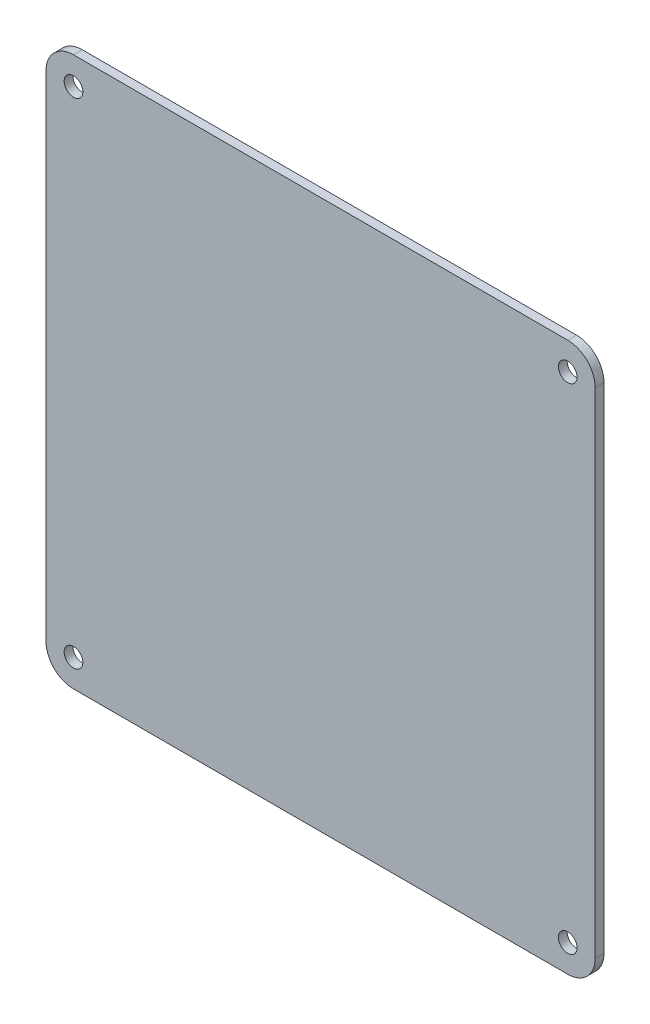
ISO-10303-21;
HEADER;
FILE_DESCRIPTION(('STEP AP214'),'2;1');
FILE_NAME('part.step','',(''),(''),'','','');
FILE_SCHEMA(('AUTOMOTIVE_DESIGN { 1 0 10303 214 1 1 1 1 }'));
ENDSEC;
DATA;
#1=APPLICATION_CONTEXT('core data for automotive mechanical design processes');
#2=APPLICATION_PROTOCOL_DEFINITION('international standard','automotive_design',2000,#1);
#3=PRODUCT_CONTEXT('',#1,'mechanical');
#4=PRODUCT('Part','Part','',(#3));
#5=PRODUCT_RELATED_PRODUCT_CATEGORY('part','',(#4));
#6=PRODUCT_DEFINITION_FORMATION('','',#4);
#7=PRODUCT_DEFINITION_CONTEXT('part definition',#1,'design');
#8=PRODUCT_DEFINITION('design','',#6,#7);
#9=PRODUCT_DEFINITION_SHAPE('','',#8);
#10=(LENGTH_UNIT() NAMED_UNIT(*) SI_UNIT(.MILLI.,.METRE.));
#11=(NAMED_UNIT(*) PLANE_ANGLE_UNIT() SI_UNIT($,.RADIAN.));
#12=(NAMED_UNIT(*) SI_UNIT($,.STERADIAN.) SOLID_ANGLE_UNIT());
#13=UNCERTAINTY_MEASURE_WITH_UNIT(LENGTH_MEASURE(1.E-05),#10,'distance_accuracy_value','');
#14=(GEOMETRIC_REPRESENTATION_CONTEXT(3) GLOBAL_UNCERTAINTY_ASSIGNED_CONTEXT((#13)) GLOBAL_UNIT_ASSIGNED_CONTEXT((#10,
#11,#12)) REPRESENTATION_CONTEXT('',''));
#15=CARTESIAN_POINT('',(0.,0.,0.));
#16=DIRECTION('',(0.,0.,1.));
#17=DIRECTION('',(1.,0.,0.));
#18=AXIS2_PLACEMENT_3D('',#15,#16,#17);
#19=CARTESIAN_POINT('',(45.,-45.,1.6));
#20=DIRECTION('',(0.,0.,-1.));
#21=DIRECTION('',(-1.,0.,0.));
#22=AXIS2_PLACEMENT_3D('',#19,#20,#21);
#23=CYLINDRICAL_SURFACE('',#22,5.);
#24=CARTESIAN_POINT('',(45.,-45.,0.));
#25=DIRECTION('',(0.,0.,1.));
#26=DIRECTION('',(-1.,0.,0.));
#27=AXIS2_PLACEMENT_3D('',#24,#25,#26);
#28=CIRCLE('',#27,5.);
#29=CARTESIAN_POINT('',(45.,-50.,0.));
#30=VERTEX_POINT('',#29);
#31=CARTESIAN_POINT('',(50.,-45.,0.));
#32=VERTEX_POINT('',#31);
#33=EDGE_CURVE('E134',#30,#32,#28,.T.);
#34=ORIENTED_EDGE('',*,*,#33,.T.);
#35=DIRECTION('',(0.,0.,-1.));
#36=VECTOR('',#35,1.);
#37=CARTESIAN_POINT('',(50.,-45.,1.6));
#38=LINE('',#37,#36);
#39=CARTESIAN_POINT('',(50.,-45.,1.6));
#40=VERTEX_POINT('',#39);
#41=EDGE_CURVE('E11',#40,#32,#38,.T.);
#42=ORIENTED_EDGE('',*,*,#41,.F.);
#43=CARTESIAN_POINT('',(45.,-45.,1.6));
#44=DIRECTION('',(0.,0.,1.));
#45=DIRECTION('',(-1.,0.,0.));
#46=AXIS2_PLACEMENT_3D('',#43,#44,#45);
#47=CIRCLE('',#46,5.);
#48=CARTESIAN_POINT('',(45.,-50.,1.6));
#49=VERTEX_POINT('',#48);
#50=EDGE_CURVE('E149',#49,#40,#47,.T.);
#51=ORIENTED_EDGE('',*,*,#50,.F.);
#52=DIRECTION('',(0.,0.,-1.));
#53=VECTOR('',#52,1.);
#54=CARTESIAN_POINT('',(45.,-50.,1.6));
#55=LINE('',#54,#53);
#56=EDGE_CURVE('E130',#49,#30,#55,.T.);
#57=ORIENTED_EDGE('',*,*,#56,.T.);
#58=EDGE_LOOP('',(#34,#42,#51,#57));
#59=FACE_BOUND('',#58,.T.);
#60=ADVANCED_FACE('F38',(#59),#23,.T.);
#61=CARTESIAN_POINT('',(50.,45.,1.6));
#62=DIRECTION('',(-1.,0.,0.));
#63=DIRECTION('',(0.,0.,1.));
#64=AXIS2_PLACEMENT_3D('',#61,#62,#63);
#65=PLANE('',#64);
#66=DIRECTION('',(0.,1.,0.));
#67=VECTOR('',#66,1.);
#68=CARTESIAN_POINT('',(50.,45.,0.));
#69=LINE('',#68,#67);
#70=CARTESIAN_POINT('',(50.,45.,0.));
#71=VERTEX_POINT('',#70);
#72=EDGE_CURVE('E137',#32,#71,#69,.T.);
#73=ORIENTED_EDGE('',*,*,#72,.T.);
#74=DIRECTION('',(0.,0.,-1.));
#75=VECTOR('',#74,1.);
#76=CARTESIAN_POINT('',(50.,45.,1.6));
#77=LINE('',#76,#75);
#78=CARTESIAN_POINT('',(50.,45.,1.6));
#79=VERTEX_POINT('',#78);
#80=EDGE_CURVE('E46',#79,#71,#77,.T.);
#81=ORIENTED_EDGE('',*,*,#80,.F.);
#82=DIRECTION('',(0.,1.,0.));
#83=VECTOR('',#82,1.);
#84=CARTESIAN_POINT('',(50.,45.,1.6));
#85=LINE('',#84,#83);
#86=EDGE_CURVE('E97',#40,#79,#85,.T.);
#87=ORIENTED_EDGE('',*,*,#86,.F.);
#88=ORIENTED_EDGE('',*,*,#41,.T.);
#89=EDGE_LOOP('',(#73,#81,#87,#88));
#90=FACE_BOUND('',#89,.T.);
#91=ADVANCED_FACE('F234',(#90),#65,.F.);
#92=CARTESIAN_POINT('',(45.,45.,1.6));
#93=DIRECTION('',(0.,0.,-1.));
#94=DIRECTION('',(-1.,0.,0.));
#95=AXIS2_PLACEMENT_3D('',#92,#93,#94);
#96=CYLINDRICAL_SURFACE('',#95,4.99999999999999);
#97=CARTESIAN_POINT('',(45.,45.,0.));
#98=DIRECTION('',(0.,0.,1.));
#99=DIRECTION('',(-1.,0.,0.));
#100=AXIS2_PLACEMENT_3D('',#97,#98,#99);
#101=CIRCLE('',#100,4.99999999999999);
#102=CARTESIAN_POINT('',(45.,50.,0.));
#103=VERTEX_POINT('',#102);
#104=EDGE_CURVE('E140',#71,#103,#101,.T.);
#105=ORIENTED_EDGE('',*,*,#104,.T.);
#106=DIRECTION('',(0.,0.,-1.));
#107=VECTOR('',#106,1.);
#108=CARTESIAN_POINT('',(45.,50.,1.6));
#109=LINE('',#108,#107);
#110=CARTESIAN_POINT('',(45.,50.,1.6));
#111=VERTEX_POINT('',#110);
#112=EDGE_CURVE('E156',#111,#103,#109,.T.);
#113=ORIENTED_EDGE('',*,*,#112,.F.);
#114=CARTESIAN_POINT('',(45.,45.,1.6));
#115=DIRECTION('',(0.,0.,1.));
#116=DIRECTION('',(-1.,0.,0.));
#117=AXIS2_PLACEMENT_3D('',#114,#115,#116);
#118=CIRCLE('',#117,4.99999999999999);
#119=EDGE_CURVE('E164',#79,#111,#118,.T.);
#120=ORIENTED_EDGE('',*,*,#119,.F.);
#121=ORIENTED_EDGE('',*,*,#80,.T.);
#122=EDGE_LOOP('',(#105,#113,#120,#121));
#123=FACE_BOUND('',#122,.T.);
#124=ADVANCED_FACE('F162',(#123),#96,.T.);
#125=CARTESIAN_POINT('',(-45.,50.,1.6));
#126=DIRECTION('',(0.,-1.,0.));
#127=DIRECTION('',(1.,0.,0.));
#128=AXIS2_PLACEMENT_3D('',#125,#126,#127);
#129=PLANE('',#128);
#130=DIRECTION('',(-1.,0.,0.));
#131=VECTOR('',#130,1.);
#132=CARTESIAN_POINT('',(-45.,50.,0.));
#133=LINE('',#132,#131);
#134=CARTESIAN_POINT('',(-45.,50.,0.));
#135=VERTEX_POINT('',#134);
#136=EDGE_CURVE('E142',#103,#135,#133,.T.);
#137=ORIENTED_EDGE('',*,*,#136,.T.);
#138=DIRECTION('',(0.,0.,-1.));
#139=VECTOR('',#138,1.);
#140=CARTESIAN_POINT('',(-45.,50.,1.6));
#141=LINE('',#140,#139);
#142=CARTESIAN_POINT('',(-45.,50.,1.6));
#143=VERTEX_POINT('',#142);
#144=EDGE_CURVE('E153',#143,#135,#141,.T.);
#145=ORIENTED_EDGE('',*,*,#144,.F.);
#146=DIRECTION('',(-1.,0.,0.));
#147=VECTOR('',#146,1.);
#148=CARTESIAN_POINT('',(-45.,50.,1.6));
#149=LINE('',#148,#147);
#150=EDGE_CURVE('E176',#111,#143,#149,.T.);
#151=ORIENTED_EDGE('',*,*,#150,.F.);
#152=ORIENTED_EDGE('',*,*,#112,.T.);
#153=EDGE_LOOP('',(#137,#145,#151,#152));
#154=FACE_BOUND('',#153,.T.);
#155=ADVANCED_FACE('F172',(#154),#129,.F.);
#156=CARTESIAN_POINT('',(-45.,45.,1.6));
#157=DIRECTION('',(0.,0.,-1.));
#158=DIRECTION('',(-1.,0.,0.));
#159=AXIS2_PLACEMENT_3D('',#156,#157,#158);
#160=CYLINDRICAL_SURFACE('',#159,4.99999999999999);
#161=CARTESIAN_POINT('',(-45.,45.,0.));
#162=DIRECTION('',(0.,0.,1.));
#163=DIRECTION('',(-1.,0.,0.));
#164=AXIS2_PLACEMENT_3D('',#161,#162,#163);
#165=CIRCLE('',#164,4.99999999999999);
#166=CARTESIAN_POINT('',(-50.,45.,0.));
#167=VERTEX_POINT('',#166);
#168=EDGE_CURVE('E144',#135,#167,#165,.T.);
#169=ORIENTED_EDGE('',*,*,#168,.T.);
#170=DIRECTION('',(0.,0.,-1.));
#171=VECTOR('',#170,1.);
#172=CARTESIAN_POINT('',(-50.,45.,1.6));
#173=LINE('',#172,#171);
#174=CARTESIAN_POINT('',(-50.,45.,1.6));
#175=VERTEX_POINT('',#174);
#176=EDGE_CURVE('E125',#175,#167,#173,.T.);
#177=ORIENTED_EDGE('',*,*,#176,.F.);
#178=CARTESIAN_POINT('',(-45.,45.,1.6));
#179=DIRECTION('',(0.,0.,1.));
#180=DIRECTION('',(-1.,0.,0.));
#181=AXIS2_PLACEMENT_3D('',#178,#179,#180);
#182=CIRCLE('',#181,4.99999999999999);
#183=EDGE_CURVE('E116',#143,#175,#182,.T.);
#184=ORIENTED_EDGE('',*,*,#183,.F.);
#185=ORIENTED_EDGE('',*,*,#144,.T.);
#186=EDGE_LOOP('',(#169,#177,#184,#185));
#187=FACE_BOUND('',#186,.T.);
#188=ADVANCED_FACE('F175',(#187),#160,.T.);
#189=CARTESIAN_POINT('',(-50.,45.,1.6));
#190=DIRECTION('',(1.,0.,0.));
#191=DIRECTION('',(0.,1.,0.));
#192=AXIS2_PLACEMENT_3D('',#189,#190,#191);
#193=PLANE('',#192);
#194=DIRECTION('',(0.,-1.,0.));
#195=VECTOR('',#194,1.);
#196=CARTESIAN_POINT('',(-50.,45.,0.));
#197=LINE('',#196,#195);
#198=CARTESIAN_POINT('',(-50.,-45.,0.));
#199=VERTEX_POINT('',#198);
#200=EDGE_CURVE('E124',#167,#199,#197,.T.);
#201=ORIENTED_EDGE('',*,*,#200,.T.);
#202=DIRECTION('',(0.,0.,-1.));
#203=VECTOR('',#202,1.);
#204=CARTESIAN_POINT('',(-50.,-45.,1.6));
#205=LINE('',#204,#203);
#206=CARTESIAN_POINT('',(-50.,-45.,1.6));
#207=VERTEX_POINT('',#206);
#208=EDGE_CURVE('E121',#207,#199,#205,.T.);
#209=ORIENTED_EDGE('',*,*,#208,.F.);
#210=DIRECTION('',(0.,-1.,0.));
#211=VECTOR('',#210,1.);
#212=CARTESIAN_POINT('',(-50.,45.,1.6));
#213=LINE('',#212,#211);
#214=EDGE_CURVE('E110',#175,#207,#213,.T.);
#215=ORIENTED_EDGE('',*,*,#214,.F.);
#216=ORIENTED_EDGE('',*,*,#176,.T.);
#217=EDGE_LOOP('',(#201,#209,#215,#216));
#218=FACE_BOUND('',#217,.T.);
#219=ADVANCED_FACE('F122',(#218),#193,.F.);
#220=CARTESIAN_POINT('',(-45.,-45.,1.6));
#221=DIRECTION('',(0.,0.,-1.));
#222=DIRECTION('',(-1.,0.,0.));
#223=AXIS2_PLACEMENT_3D('',#220,#221,#222);
#224=CYLINDRICAL_SURFACE('',#223,5.);
#225=CARTESIAN_POINT('',(-45.,-45.,0.));
#226=DIRECTION('',(0.,0.,1.));
#227=DIRECTION('',(1.,0.,0.));
#228=AXIS2_PLACEMENT_3D('',#225,#226,#227);
#229=CIRCLE('',#228,5.);
#230=CARTESIAN_POINT('',(-45.,-50.,0.));
#231=VERTEX_POINT('',#230);
#232=EDGE_CURVE('E83',#199,#231,#229,.T.);
#233=ORIENTED_EDGE('',*,*,#232,.T.);
#234=DIRECTION('',(0.,0.,-1.));
#235=VECTOR('',#234,1.);
#236=CARTESIAN_POINT('',(-45.,-50.,1.6));
#237=LINE('',#236,#235);
#238=CARTESIAN_POINT('',(-45.,-50.,1.6));
#239=VERTEX_POINT('',#238);
#240=EDGE_CURVE('E126',#239,#231,#237,.T.);
#241=ORIENTED_EDGE('',*,*,#240,.F.);
#242=CARTESIAN_POINT('',(-45.,-45.,1.6));
#243=DIRECTION('',(0.,0.,1.));
#244=DIRECTION('',(1.,0.,0.));
#245=AXIS2_PLACEMENT_3D('',#242,#243,#244);
#246=CIRCLE('',#245,5.);
#247=EDGE_CURVE('E114',#207,#239,#246,.T.);
#248=ORIENTED_EDGE('',*,*,#247,.F.);
#249=ORIENTED_EDGE('',*,*,#208,.T.);
#250=EDGE_LOOP('',(#233,#241,#248,#249));
#251=FACE_BOUND('',#250,.T.);
#252=ADVANCED_FACE('F128',(#251),#224,.T.);
#253=CARTESIAN_POINT('',(-45.,-50.,1.6));
#254=DIRECTION('',(0.,1.,0.));
#255=DIRECTION('',(-1.,0.,0.));
#256=AXIS2_PLACEMENT_3D('',#253,#254,#255);
#257=PLANE('',#256);
#258=DIRECTION('',(1.,0.,0.));
#259=VECTOR('',#258,1.);
#260=CARTESIAN_POINT('',(-45.,-50.,0.));
#261=LINE('',#260,#259);
#262=EDGE_CURVE('E89',#231,#30,#261,.T.);
#263=ORIENTED_EDGE('',*,*,#262,.T.);
#264=ORIENTED_EDGE('',*,*,#56,.F.);
#265=DIRECTION('',(1.,0.,0.));
#266=VECTOR('',#265,1.);
#267=CARTESIAN_POINT('',(-45.,-50.,1.6));
#268=LINE('',#267,#266);
#269=EDGE_CURVE('E54',#239,#49,#268,.T.);
#270=ORIENTED_EDGE('',*,*,#269,.F.);
#271=ORIENTED_EDGE('',*,*,#240,.T.);
#272=EDGE_LOOP('',(#263,#264,#270,#271));
#273=FACE_BOUND('',#272,.T.);
#274=ADVANCED_FACE('F210',(#273),#257,.F.);
#275=CARTESIAN_POINT('',(45.,-45.,1.6));
#276=DIRECTION('',(0.,0.,-1.));
#277=DIRECTION('',(-1.,0.,0.));
#278=AXIS2_PLACEMENT_3D('',#275,#276,#277);
#279=PLANE('',#278);
#280=CARTESIAN_POINT('',(45.,45.,1.6));
#281=DIRECTION('',(0.,0.,1.));
#282=DIRECTION('',(1.,0.,0.));
#283=AXIS2_PLACEMENT_3D('',#280,#281,#282);
#284=CIRCLE('',#283,1.69999999999999);
#285=CARTESIAN_POINT('',(46.7,45.,1.6));
#286=VERTEX_POINT('',#285);
#287=EDGE_CURVE('E202',#286,#286,#284,.T.);
#288=ORIENTED_EDGE('',*,*,#287,.F.);
#289=EDGE_LOOP('',(#288));
#290=FACE_BOUND('',#289,.T.);
#291=CARTESIAN_POINT('',(-45.,45.,1.6));
#292=DIRECTION('',(0.,0.,1.));
#293=DIRECTION('',(1.,0.,0.));
#294=AXIS2_PLACEMENT_3D('',#291,#292,#293);
#295=CIRCLE('',#294,1.69999999999999);
#296=CARTESIAN_POINT('',(-43.3,45.,1.6));
#297=VERTEX_POINT('',#296);
#298=EDGE_CURVE('E196',#297,#297,#295,.T.);
#299=ORIENTED_EDGE('',*,*,#298,.F.);
#300=EDGE_LOOP('',(#299));
#301=FACE_BOUND('',#300,.T.);
#302=CARTESIAN_POINT('',(-45.,-45.,1.6));
#303=DIRECTION('',(0.,0.,1.));
#304=DIRECTION('',(1.,0.,0.));
#305=AXIS2_PLACEMENT_3D('',#302,#303,#304);
#306=CIRCLE('',#305,1.69999999999999);
#307=CARTESIAN_POINT('',(-43.3,-45.,1.6));
#308=VERTEX_POINT('',#307);
#309=EDGE_CURVE('E190',#308,#308,#306,.T.);
#310=ORIENTED_EDGE('',*,*,#309,.F.);
#311=EDGE_LOOP('',(#310));
#312=FACE_BOUND('',#311,.T.);
#313=CARTESIAN_POINT('',(45.,-45.,1.6));
#314=DIRECTION('',(0.,0.,1.));
#315=DIRECTION('',(1.,0.,0.));
#316=AXIS2_PLACEMENT_3D('',#313,#314,#315);
#317=CIRCLE('',#316,1.69999999999999);
#318=CARTESIAN_POINT('',(46.7,-45.,1.6));
#319=VERTEX_POINT('',#318);
#320=EDGE_CURVE('E184',#319,#319,#317,.T.);
#321=ORIENTED_EDGE('',*,*,#320,.F.);
#322=EDGE_LOOP('',(#321));
#323=FACE_BOUND('',#322,.T.);
#324=ORIENTED_EDGE('',*,*,#50,.T.);
#325=ORIENTED_EDGE('',*,*,#86,.T.);
#326=ORIENTED_EDGE('',*,*,#119,.T.);
#327=ORIENTED_EDGE('',*,*,#150,.T.);
#328=ORIENTED_EDGE('',*,*,#183,.T.);
#329=ORIENTED_EDGE('',*,*,#214,.T.);
#330=ORIENTED_EDGE('',*,*,#247,.T.);
#331=ORIENTED_EDGE('',*,*,#269,.T.);
#332=EDGE_LOOP('',(#324,#325,#326,#327,#328,#329,#330,#331));
#333=FACE_BOUND('',#332,.T.);
#334=ADVANCED_FACE('F112',(#290,#301,#312,#323,#333),#279,.F.);
#335=CARTESIAN_POINT('',(45.,-45.,0.));
#336=DIRECTION('',(0.,0.,-1.));
#337=DIRECTION('',(-1.,0.,0.));
#338=AXIS2_PLACEMENT_3D('',#335,#336,#337);
#339=PLANE('',#338);
#340=CARTESIAN_POINT('',(45.,45.,0.));
#341=DIRECTION('',(0.,0.,1.));
#342=DIRECTION('',(1.,0.,0.));
#343=AXIS2_PLACEMENT_3D('',#340,#341,#342);
#344=CIRCLE('',#343,1.7);
#345=CARTESIAN_POINT('',(46.7,45.,0.));
#346=VERTEX_POINT('',#345);
#347=EDGE_CURVE('E199',#346,#346,#344,.T.);
#348=ORIENTED_EDGE('',*,*,#347,.T.);
#349=EDGE_LOOP('',(#348));
#350=FACE_BOUND('',#349,.T.);
#351=CARTESIAN_POINT('',(-45.,45.,0.));
#352=DIRECTION('',(0.,0.,1.));
#353=DIRECTION('',(1.,0.,0.));
#354=AXIS2_PLACEMENT_3D('',#351,#352,#353);
#355=CIRCLE('',#354,1.7);
#356=CARTESIAN_POINT('',(-43.3,45.,0.));
#357=VERTEX_POINT('',#356);
#358=EDGE_CURVE('E193',#357,#357,#355,.T.);
#359=ORIENTED_EDGE('',*,*,#358,.T.);
#360=EDGE_LOOP('',(#359));
#361=FACE_BOUND('',#360,.T.);
#362=CARTESIAN_POINT('',(-45.,-45.,0.));
#363=DIRECTION('',(0.,0.,1.));
#364=DIRECTION('',(1.,0.,0.));
#365=AXIS2_PLACEMENT_3D('',#362,#363,#364);
#366=CIRCLE('',#365,1.7);
#367=CARTESIAN_POINT('',(-43.3,-45.,0.));
#368=VERTEX_POINT('',#367);
#369=EDGE_CURVE('E187',#368,#368,#366,.T.);
#370=ORIENTED_EDGE('',*,*,#369,.T.);
#371=EDGE_LOOP('',(#370));
#372=FACE_BOUND('',#371,.T.);
#373=CARTESIAN_POINT('',(45.,-45.,0.));
#374=DIRECTION('',(0.,0.,1.));
#375=DIRECTION('',(1.,0.,0.));
#376=AXIS2_PLACEMENT_3D('',#373,#374,#375);
#377=CIRCLE('',#376,1.7);
#378=CARTESIAN_POINT('',(46.7,-45.,0.));
#379=VERTEX_POINT('',#378);
#380=EDGE_CURVE('E138',#379,#379,#377,.T.);
#381=ORIENTED_EDGE('',*,*,#380,.T.);
#382=EDGE_LOOP('',(#381));
#383=FACE_BOUND('',#382,.T.);
#384=ORIENTED_EDGE('',*,*,#33,.F.);
#385=ORIENTED_EDGE('',*,*,#262,.F.);
#386=ORIENTED_EDGE('',*,*,#232,.F.);
#387=ORIENTED_EDGE('',*,*,#200,.F.);
#388=ORIENTED_EDGE('',*,*,#168,.F.);
#389=ORIENTED_EDGE('',*,*,#136,.F.);
#390=ORIENTED_EDGE('',*,*,#104,.F.);
#391=ORIENTED_EDGE('',*,*,#72,.F.);
#392=EDGE_LOOP('',(#384,#385,#386,#387,#388,#389,#390,#391));
#393=FACE_BOUND('',#392,.T.);
#394=ADVANCED_FACE('F168',(#350,#361,#372,#383,#393),#339,.T.);
#395=CARTESIAN_POINT('',(45.,-45.,1.6));
#396=DIRECTION('',(0.,0.,1.));
#397=DIRECTION('',(1.,0.,0.));
#398=AXIS2_PLACEMENT_3D('',#395,#396,#397);
#399=CYLINDRICAL_SURFACE('',#398,1.69999999999999);
#400=ORIENTED_EDGE('',*,*,#380,.F.);
#401=EDGE_LOOP('',(#400));
#402=FACE_BOUND('',#401,.T.);
#403=ORIENTED_EDGE('',*,*,#320,.T.);
#404=EDGE_LOOP('',(#403));
#405=FACE_BOUND('',#404,.T.);
#406=ADVANCED_FACE('F218',(#402,#405),#399,.F.);
#407=CARTESIAN_POINT('',(-45.,-45.,1.6));
#408=DIRECTION('',(0.,0.,1.));
#409=DIRECTION('',(1.,0.,0.));
#410=AXIS2_PLACEMENT_3D('',#407,#408,#409);
#411=CYLINDRICAL_SURFACE('',#410,1.69999999999999);
#412=ORIENTED_EDGE('',*,*,#369,.F.);
#413=EDGE_LOOP('',(#412));
#414=FACE_BOUND('',#413,.T.);
#415=ORIENTED_EDGE('',*,*,#309,.T.);
#416=EDGE_LOOP('',(#415));
#417=FACE_BOUND('',#416,.T.);
#418=ADVANCED_FACE('F220',(#414,#417),#411,.F.);
#419=CARTESIAN_POINT('',(-45.,45.,1.6));
#420=DIRECTION('',(0.,0.,1.));
#421=DIRECTION('',(1.,0.,0.));
#422=AXIS2_PLACEMENT_3D('',#419,#420,#421);
#423=CYLINDRICAL_SURFACE('',#422,1.69999999999999);
#424=ORIENTED_EDGE('',*,*,#358,.F.);
#425=EDGE_LOOP('',(#424));
#426=FACE_BOUND('',#425,.T.);
#427=ORIENTED_EDGE('',*,*,#298,.T.);
#428=EDGE_LOOP('',(#427));
#429=FACE_BOUND('',#428,.T.);
#430=ADVANCED_FACE('F227',(#426,#429),#423,.F.);
#431=CARTESIAN_POINT('',(45.,45.,1.6));
#432=DIRECTION('',(0.,0.,1.));
#433=DIRECTION('',(1.,0.,0.));
#434=AXIS2_PLACEMENT_3D('',#431,#432,#433);
#435=CYLINDRICAL_SURFACE('',#434,1.69999999999999);
#436=ORIENTED_EDGE('',*,*,#347,.F.);
#437=EDGE_LOOP('',(#436));
#438=FACE_BOUND('',#437,.T.);
#439=ORIENTED_EDGE('',*,*,#287,.T.);
#440=EDGE_LOOP('',(#439));
#441=FACE_BOUND('',#440,.T.);
#442=ADVANCED_FACE('F206',(#438,#441),#435,.F.);
#443=CLOSED_SHELL('',(#60,#91,#124,#155,#188,#219,#252,#274,#334,#394,#406,#418,#430,#442));
#444=MANIFOLD_SOLID_BREP('B2',#443);
#445=ADVANCED_BREP_SHAPE_REPRESENTATION('',(#18,#444),#14);
#446=SHAPE_DEFINITION_REPRESENTATION(#9,#445);
ENDSEC;
END-ISO-10303-21;
